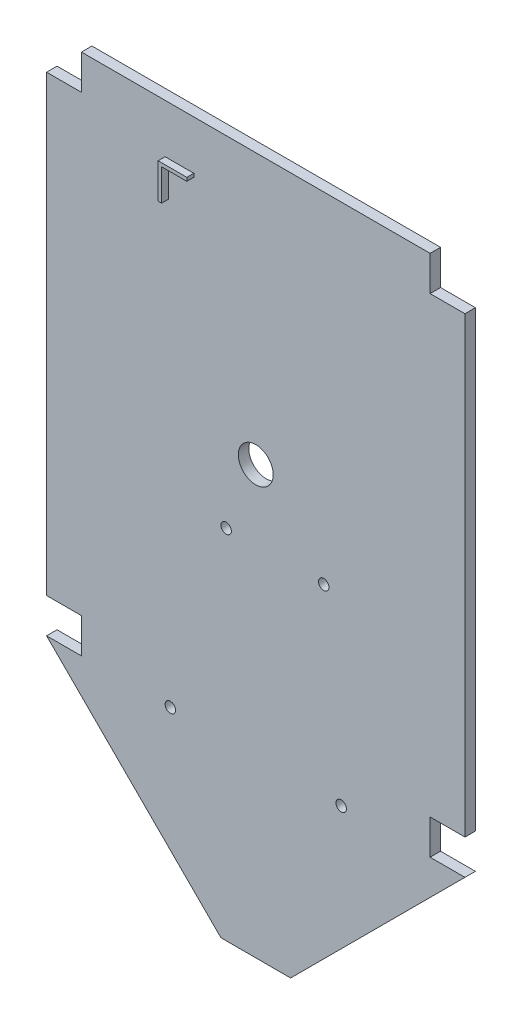
ISO-10303-21;
HEADER;
FILE_DESCRIPTION(('STEP AP214'),'2;1');
FILE_NAME('part.step','',(''),(''),'','','');
FILE_SCHEMA(('AUTOMOTIVE_DESIGN { 1 0 10303 214 1 1 1 1 }'));
ENDSEC;
DATA;
#1=APPLICATION_CONTEXT('core data for automotive mechanical design processes');
#2=APPLICATION_PROTOCOL_DEFINITION('international standard','automotive_design',2000,#1);
#3=PRODUCT_CONTEXT('',#1,'mechanical');
#4=PRODUCT('Part','Part','',(#3));
#5=PRODUCT_RELATED_PRODUCT_CATEGORY('part','',(#4));
#6=PRODUCT_DEFINITION_FORMATION('','',#4);
#7=PRODUCT_DEFINITION_CONTEXT('part definition',#1,'design');
#8=PRODUCT_DEFINITION('design','',#6,#7);
#9=PRODUCT_DEFINITION_SHAPE('','',#8);
#10=(LENGTH_UNIT() NAMED_UNIT(*) SI_UNIT(.MILLI.,.METRE.));
#11=(NAMED_UNIT(*) PLANE_ANGLE_UNIT() SI_UNIT($,.RADIAN.));
#12=(NAMED_UNIT(*) SI_UNIT($,.STERADIAN.) SOLID_ANGLE_UNIT());
#13=UNCERTAINTY_MEASURE_WITH_UNIT(LENGTH_MEASURE(1.E-05),#10,'distance_accuracy_value','');
#14=(GEOMETRIC_REPRESENTATION_CONTEXT(3) GLOBAL_UNCERTAINTY_ASSIGNED_CONTEXT((#13)) GLOBAL_UNIT_ASSIGNED_CONTEXT((#10,
#11,#12)) REPRESENTATION_CONTEXT('',''));
#15=CARTESIAN_POINT('',(0.,0.,0.));
#16=DIRECTION('',(0.,0.,1.));
#17=DIRECTION('',(1.,0.,0.));
#18=AXIS2_PLACEMENT_3D('',#15,#16,#17);
#19=CARTESIAN_POINT('',(0.,-210.,3.));
#20=DIRECTION('',(0.,0.,1.));
#21=DIRECTION('',(1.,0.,0.));
#22=AXIS2_PLACEMENT_3D('',#19,#20,#21);
#23=PLANE('',#22);
#24=CARTESIAN_POINT('',(1.59594559789866E-13,-77.5,3.));
#25=DIRECTION('',(0.,0.,1.));
#26=DIRECTION('',(1.,0.,0.));
#27=AXIS2_PLACEMENT_3D('',#24,#25,#26);
#28=CIRCLE('',#27,5.);
#29=CARTESIAN_POINT('',(5.00000000000016,-77.5,3.));
#30=VERTEX_POINT('',#29);
#31=EDGE_CURVE('E636',#30,#30,#28,.T.);
#32=ORIENTED_EDGE('',*,*,#31,.F.);
#33=EDGE_LOOP('',(#32));
#34=FACE_BOUND('',#33,.T.);
#35=DIRECTION('',(0.707106781186546,0.707106781186549,0.));
#36=VECTOR('',#35,1.);
#37=CARTESIAN_POINT('',(59.9999999999998,-150.,3.));
#38=LINE('',#37,#36);
#39=CARTESIAN_POINT('',(9.99999999999994,-200.,3.));
#40=VERTEX_POINT('',#39);
#41=CARTESIAN_POINT('',(59.9999999999998,-150.,3.));
#42=VERTEX_POINT('',#41);
#43=EDGE_CURVE('E222',#40,#42,#38,.T.);
#44=ORIENTED_EDGE('',*,*,#43,.T.);
#45=DIRECTION('',(-1.,0.,0.));
#46=VECTOR('',#45,1.);
#47=CARTESIAN_POINT('',(59.9999999999998,-150.,3.));
#48=LINE('',#47,#46);
#49=CARTESIAN_POINT('',(49.9999999999998,-150.,3.));
#50=VERTEX_POINT('',#49);
#51=EDGE_CURVE('E122',#42,#50,#48,.T.);
#52=ORIENTED_EDGE('',*,*,#51,.T.);
#53=DIRECTION('',(0.,1.,0.));
#54=VECTOR('',#53,1.);
#55=CARTESIAN_POINT('',(49.9999999999998,-150.,3.));
#56=LINE('',#55,#54);
#57=CARTESIAN_POINT('',(49.9999999999998,-140.,3.));
#58=VERTEX_POINT('',#57);
#59=EDGE_CURVE('E291',#50,#58,#56,.T.);
#60=ORIENTED_EDGE('',*,*,#59,.T.);
#61=DIRECTION('',(1.,0.,0.));
#62=VECTOR('',#61,1.);
#63=CARTESIAN_POINT('',(49.9999999999998,-140.,3.));
#64=LINE('',#63,#62);
#65=CARTESIAN_POINT('',(59.9999999999998,-140.,3.));
#66=VERTEX_POINT('',#65);
#67=EDGE_CURVE('E293',#58,#66,#64,.T.);
#68=ORIENTED_EDGE('',*,*,#67,.T.);
#69=DIRECTION('',(0.,1.,0.));
#70=VECTOR('',#69,1.);
#71=CARTESIAN_POINT('',(59.9999999999998,-10.,3.));
#72=LINE('',#71,#70);
#73=CARTESIAN_POINT('',(59.9999999999998,-10.,3.));
#74=VERTEX_POINT('',#73);
#75=EDGE_CURVE('E295',#66,#74,#72,.T.);
#76=ORIENTED_EDGE('',*,*,#75,.T.);
#77=DIRECTION('',(-1.,0.,0.));
#78=VECTOR('',#77,1.);
#79=CARTESIAN_POINT('',(49.9999999999998,-10.,3.));
#80=LINE('',#79,#78);
#81=CARTESIAN_POINT('',(49.9999999999998,-10.,3.));
#82=VERTEX_POINT('',#81);
#83=EDGE_CURVE('E297',#74,#82,#80,.T.);
#84=ORIENTED_EDGE('',*,*,#83,.T.);
#85=DIRECTION('',(0.,1.,0.));
#86=VECTOR('',#85,1.);
#87=CARTESIAN_POINT('',(49.9999999999998,0.,3.));
#88=LINE('',#87,#86);
#89=CARTESIAN_POINT('',(49.9999999999998,0.,3.));
#90=VERTEX_POINT('',#89);
#91=EDGE_CURVE('E299',#82,#90,#88,.T.);
#92=ORIENTED_EDGE('',*,*,#91,.T.);
#93=DIRECTION('',(-1.,0.,0.));
#94=VECTOR('',#93,1.);
#95=CARTESIAN_POINT('',(49.9999999999998,0.,3.));
#96=LINE('',#95,#94);
#97=CARTESIAN_POINT('',(-49.9999999999998,0.,3.));
#98=VERTEX_POINT('',#97);
#99=EDGE_CURVE('E301',#90,#98,#96,.T.);
#100=ORIENTED_EDGE('',*,*,#99,.T.);
#101=DIRECTION('',(0.,-1.,0.));
#102=VECTOR('',#101,1.);
#103=CARTESIAN_POINT('',(-49.9999999999998,0.,3.));
#104=LINE('',#103,#102);
#105=CARTESIAN_POINT('',(-49.9999999999998,-10.,3.));
#106=VERTEX_POINT('',#105);
#107=EDGE_CURVE('E303',#98,#106,#104,.T.);
#108=ORIENTED_EDGE('',*,*,#107,.T.);
#109=DIRECTION('',(-1.,0.,0.));
#110=VECTOR('',#109,1.);
#111=CARTESIAN_POINT('',(-49.9999999999998,-10.,3.));
#112=LINE('',#111,#110);
#113=CARTESIAN_POINT('',(-59.9999999999998,-10.,3.));
#114=VERTEX_POINT('',#113);
#115=EDGE_CURVE('E305',#106,#114,#112,.T.);
#116=ORIENTED_EDGE('',*,*,#115,.T.);
#117=DIRECTION('',(0.,-1.,0.));
#118=VECTOR('',#117,1.);
#119=CARTESIAN_POINT('',(-59.9999999999998,-10.,3.));
#120=LINE('',#119,#118);
#121=CARTESIAN_POINT('',(-59.9999999999998,-140.,3.));
#122=VERTEX_POINT('',#121);
#123=EDGE_CURVE('E307',#114,#122,#120,.T.);
#124=ORIENTED_EDGE('',*,*,#123,.T.);
#125=DIRECTION('',(1.,0.,0.));
#126=VECTOR('',#125,1.);
#127=CARTESIAN_POINT('',(-49.9999999999998,-140.,3.));
#128=LINE('',#127,#126);
#129=CARTESIAN_POINT('',(-49.9999999999998,-140.,3.));
#130=VERTEX_POINT('',#129);
#131=EDGE_CURVE('E309',#122,#130,#128,.T.);
#132=ORIENTED_EDGE('',*,*,#131,.T.);
#133=DIRECTION('',(0.,-1.,0.));
#134=VECTOR('',#133,1.);
#135=CARTESIAN_POINT('',(-49.9999999999998,-150.,3.));
#136=LINE('',#135,#134);
#137=CARTESIAN_POINT('',(-49.9999999999998,-150.,3.));
#138=VERTEX_POINT('',#137);
#139=EDGE_CURVE('E169',#130,#138,#136,.T.);
#140=ORIENTED_EDGE('',*,*,#139,.T.);
#141=DIRECTION('',(-1.,0.,0.));
#142=VECTOR('',#141,1.);
#143=CARTESIAN_POINT('',(-59.9999999999998,-150.,3.));
#144=LINE('',#143,#142);
#145=CARTESIAN_POINT('',(-59.9999999999998,-150.,3.));
#146=VERTEX_POINT('',#145);
#147=EDGE_CURVE('E162',#138,#146,#144,.T.);
#148=ORIENTED_EDGE('',*,*,#147,.T.);
#149=DIRECTION('',(0.707106781186546,-0.707106781186549,0.));
#150=VECTOR('',#149,1.);
#151=CARTESIAN_POINT('',(-59.9999999999998,-150.,3.));
#152=LINE('',#151,#150);
#153=CARTESIAN_POINT('',(-9.99999999999994,-200.,3.));
#154=VERTEX_POINT('',#153);
#155=EDGE_CURVE('E166',#146,#154,#152,.T.);
#156=ORIENTED_EDGE('',*,*,#155,.T.);
#157=DIRECTION('',(1.,0.,0.));
#158=VECTOR('',#157,1.);
#159=CARTESIAN_POINT('',(-9.99999999999994,-200.,3.));
#160=LINE('',#159,#158);
#161=EDGE_CURVE('E57',#154,#40,#160,.T.);
#162=ORIENTED_EDGE('',*,*,#161,.T.);
#163=EDGE_LOOP('',(#44,#52,#60,#68,#76,#84,#92,#100,#108,#116,#124,#132,#140,#148,#156,#162));
#164=FACE_BOUND('',#163,.T.);
#165=CARTESIAN_POINT('',(-24.4999999999998,-150.,3.));
#166=DIRECTION('',(0.,0.,1.));
#167=DIRECTION('',(1.,0.,0.));
#168=AXIS2_PLACEMENT_3D('',#165,#166,#167);
#169=CIRCLE('',#168,1.5);
#170=CARTESIAN_POINT('',(-22.9999999999998,-150.,3.));
#171=VERTEX_POINT('',#170);
#172=EDGE_CURVE('E260',#171,#171,#169,.T.);
#173=ORIENTED_EDGE('',*,*,#172,.F.);
#174=EDGE_LOOP('',(#173));
#175=FACE_BOUND('',#174,.T.);
#176=CARTESIAN_POINT('',(-8.49999999999984,-97.5,3.));
#177=DIRECTION('',(0.,0.,1.));
#178=DIRECTION('',(1.,0.,0.));
#179=AXIS2_PLACEMENT_3D('',#176,#177,#178);
#180=CIRCLE('',#179,1.5);
#181=CARTESIAN_POINT('',(-6.99999999999984,-97.5,3.));
#182=VERTEX_POINT('',#181);
#183=EDGE_CURVE('E264',#182,#182,#180,.T.);
#184=ORIENTED_EDGE('',*,*,#183,.F.);
#185=EDGE_LOOP('',(#184));
#186=FACE_BOUND('',#185,.T.);
#187=CARTESIAN_POINT('',(19.5000000000002,-97.5,3.));
#188=DIRECTION('',(0.,0.,1.));
#189=DIRECTION('',(1.,0.,0.));
#190=AXIS2_PLACEMENT_3D('',#187,#188,#189);
#191=CIRCLE('',#190,1.5);
#192=CARTESIAN_POINT('',(21.0000000000002,-97.5,3.));
#193=VERTEX_POINT('',#192);
#194=EDGE_CURVE('E267',#193,#193,#191,.T.);
#195=ORIENTED_EDGE('',*,*,#194,.F.);
#196=EDGE_LOOP('',(#195));
#197=FACE_BOUND('',#196,.T.);
#198=CARTESIAN_POINT('',(24.5000000000002,-150.,3.));
#199=DIRECTION('',(0.,0.,1.));
#200=DIRECTION('',(1.,0.,0.));
#201=AXIS2_PLACEMENT_3D('',#198,#199,#200);
#202=CIRCLE('',#201,1.5);
#203=CARTESIAN_POINT('',(26.0000000000002,-150.,3.));
#204=VERTEX_POINT('',#203);
#205=EDGE_CURVE('E270',#204,#204,#202,.T.);
#206=ORIENTED_EDGE('',*,*,#205,.F.);
#207=EDGE_LOOP('',(#206));
#208=FACE_BOUND('',#207,.T.);
#209=DIRECTION('',(0.,1.,0.));
#210=VECTOR('',#209,1.);
#211=CARTESIAN_POINT('',(-17.7737762237761,-15.,3.));
#212=LINE('',#211,#210);
#213=CARTESIAN_POINT('',(-17.7737762237761,-15.,3.));
#214=VERTEX_POINT('',#213);
#215=CARTESIAN_POINT('',(-17.7737762237761,-14.,3.));
#216=VERTEX_POINT('',#215);
#217=EDGE_CURVE('E641',#214,#216,#212,.T.);
#218=ORIENTED_EDGE('',*,*,#217,.F.);
#219=DIRECTION('',(1.,0.,0.));
#220=VECTOR('',#219,1.);
#221=CARTESIAN_POINT('',(-24.9999999999998,-15.,3.));
#222=LINE('',#221,#220);
#223=CARTESIAN_POINT('',(-24.9999999999998,-15.,3.));
#224=VERTEX_POINT('',#223);
#225=EDGE_CURVE('E639',#224,#214,#222,.T.);
#226=ORIENTED_EDGE('',*,*,#225,.F.);
#227=DIRECTION('',(0.,1.,0.));
#228=VECTOR('',#227,1.);
#229=CARTESIAN_POINT('',(-24.9999999999998,-15.,3.));
#230=LINE('',#229,#228);
#231=CARTESIAN_POINT('',(-24.9999999999998,-24.0374844599845,3.));
#232=VERTEX_POINT('',#231);
#233=EDGE_CURVE('E649',#232,#224,#230,.T.);
#234=ORIENTED_EDGE('',*,*,#233,.F.);
#235=DIRECTION('',(1.,0.,0.));
#236=VECTOR('',#235,1.);
#237=CARTESIAN_POINT('',(-25.9999999999998,-24.0374844599845,3.));
#238=LINE('',#237,#236);
#239=CARTESIAN_POINT('',(-25.9999999999998,-24.0374844599845,3.));
#240=VERTEX_POINT('',#239);
#241=EDGE_CURVE('E673',#240,#232,#238,.T.);
#242=ORIENTED_EDGE('',*,*,#241,.F.);
#243=DIRECTION('',(0.,-1.,0.));
#244=VECTOR('',#243,1.);
#245=CARTESIAN_POINT('',(-25.9999999999998,-14.,3.));
#246=LINE('',#245,#244);
#247=CARTESIAN_POINT('',(-25.9999999999998,-14.,3.));
#248=VERTEX_POINT('',#247);
#249=EDGE_CURVE('E670',#248,#240,#246,.T.);
#250=ORIENTED_EDGE('',*,*,#249,.F.);
#251=DIRECTION('',(-1.,0.,0.));
#252=VECTOR('',#251,1.);
#253=CARTESIAN_POINT('',(-17.7737762237761,-14.,3.));
#254=LINE('',#253,#252);
#255=EDGE_CURVE('E667',#216,#248,#254,.T.);
#256=ORIENTED_EDGE('',*,*,#255,.F.);
#257=EDGE_LOOP('',(#218,#226,#234,#242,#250,#256));
#258=FACE_BOUND('',#257,.T.);
#259=ADVANCED_FACE('F31',(#34,#164,#175,#186,#197,#208,#258),#23,.T.);
#260=CARTESIAN_POINT('',(59.9999999999998,-150.,3.));
#261=DIRECTION('',(-0.707106781186549,0.707106781186546,0.));
#262=DIRECTION('',(-0.707106781186546,-0.707106781186549,0.));
#263=AXIS2_PLACEMENT_3D('',#260,#261,#262);
#264=PLANE('',#263);
#265=DIRECTION('',(0.707106781186546,0.707106781186549,0.));
#266=VECTOR('',#265,1.);
#267=CARTESIAN_POINT('',(59.9999999999998,-150.,0.));
#268=LINE('',#267,#266);
#269=CARTESIAN_POINT('',(9.99999999999994,-200.,0.));
#270=VERTEX_POINT('',#269);
#271=CARTESIAN_POINT('',(59.9999999999998,-150.,0.));
#272=VERTEX_POINT('',#271);
#273=EDGE_CURVE('E190',#270,#272,#268,.T.);
#274=ORIENTED_EDGE('',*,*,#273,.T.);
#275=DIRECTION('',(0.,0.,-1.));
#276=VECTOR('',#275,1.);
#277=CARTESIAN_POINT('',(59.9999999999998,-150.,3.));
#278=LINE('',#277,#276);
#279=EDGE_CURVE('E11',#42,#272,#278,.T.);
#280=ORIENTED_EDGE('',*,*,#279,.F.);
#281=ORIENTED_EDGE('',*,*,#43,.F.);
#282=DIRECTION('',(0.,0.,-1.));
#283=VECTOR('',#282,1.);
#284=CARTESIAN_POINT('',(9.99999999999994,-200.,3.));
#285=LINE('',#284,#283);
#286=EDGE_CURVE('E186',#40,#270,#285,.T.);
#287=ORIENTED_EDGE('',*,*,#286,.T.);
#288=EDGE_LOOP('',(#274,#280,#281,#287));
#289=FACE_BOUND('',#288,.T.);
#290=ADVANCED_FACE('F33',(#289),#264,.F.);
#291=CARTESIAN_POINT('',(59.9999999999998,-150.,3.));
#292=DIRECTION('',(0.,-1.,0.));
#293=DIRECTION('',(0.,0.,-1.));
#294=AXIS2_PLACEMENT_3D('',#291,#292,#293);
#295=PLANE('',#294);
#296=DIRECTION('',(-1.,0.,0.));
#297=VECTOR('',#296,1.);
#298=CARTESIAN_POINT('',(59.9999999999998,-150.,0.));
#299=LINE('',#298,#297);
#300=CARTESIAN_POINT('',(49.9999999999998,-150.,0.));
#301=VERTEX_POINT('',#300);
#302=EDGE_CURVE('E193',#272,#301,#299,.T.);
#303=ORIENTED_EDGE('',*,*,#302,.T.);
#304=DIRECTION('',(0.,0.,-1.));
#305=VECTOR('',#304,1.);
#306=CARTESIAN_POINT('',(49.9999999999998,-150.,3.));
#307=LINE('',#306,#305);
#308=EDGE_CURVE('E40',#50,#301,#307,.T.);
#309=ORIENTED_EDGE('',*,*,#308,.F.);
#310=ORIENTED_EDGE('',*,*,#51,.F.);
#311=ORIENTED_EDGE('',*,*,#279,.T.);
#312=EDGE_LOOP('',(#303,#309,#310,#311));
#313=FACE_BOUND('',#312,.T.);
#314=ADVANCED_FACE('F329',(#313),#295,.F.);
#315=CARTESIAN_POINT('',(49.9999999999998,-150.,3.));
#316=DIRECTION('',(-1.,0.,0.));
#317=DIRECTION('',(0.,0.,1.));
#318=AXIS2_PLACEMENT_3D('',#315,#316,#317);
#319=PLANE('',#318);
#320=DIRECTION('',(0.,1.,0.));
#321=VECTOR('',#320,1.);
#322=CARTESIAN_POINT('',(49.9999999999998,-150.,0.));
#323=LINE('',#322,#321);
#324=CARTESIAN_POINT('',(49.9999999999998,-140.,0.));
#325=VERTEX_POINT('',#324);
#326=EDGE_CURVE('E196',#301,#325,#323,.T.);
#327=ORIENTED_EDGE('',*,*,#326,.T.);
#328=DIRECTION('',(0.,0.,-1.));
#329=VECTOR('',#328,1.);
#330=CARTESIAN_POINT('',(49.9999999999998,-140.,3.));
#331=LINE('',#330,#329);
#332=EDGE_CURVE('E253',#58,#325,#331,.T.);
#333=ORIENTED_EDGE('',*,*,#332,.F.);
#334=ORIENTED_EDGE('',*,*,#59,.F.);
#335=ORIENTED_EDGE('',*,*,#308,.T.);
#336=EDGE_LOOP('',(#327,#333,#334,#335));
#337=FACE_BOUND('',#336,.T.);
#338=ADVANCED_FACE('F332',(#337),#319,.F.);
#339=CARTESIAN_POINT('',(49.9999999999998,-140.,3.));
#340=DIRECTION('',(0.,1.,0.));
#341=DIRECTION('',(0.,0.,1.));
#342=AXIS2_PLACEMENT_3D('',#339,#340,#341);
#343=PLANE('',#342);
#344=DIRECTION('',(1.,0.,0.));
#345=VECTOR('',#344,1.);
#346=CARTESIAN_POINT('',(49.9999999999998,-140.,0.));
#347=LINE('',#346,#345);
#348=CARTESIAN_POINT('',(59.9999999999998,-140.,0.));
#349=VERTEX_POINT('',#348);
#350=EDGE_CURVE('E198',#325,#349,#347,.T.);
#351=ORIENTED_EDGE('',*,*,#350,.T.);
#352=DIRECTION('',(0.,0.,-1.));
#353=VECTOR('',#352,1.);
#354=CARTESIAN_POINT('',(59.9999999999998,-140.,3.));
#355=LINE('',#354,#353);
#356=EDGE_CURVE('E250',#66,#349,#355,.T.);
#357=ORIENTED_EDGE('',*,*,#356,.F.);
#358=ORIENTED_EDGE('',*,*,#67,.F.);
#359=ORIENTED_EDGE('',*,*,#332,.T.);
#360=EDGE_LOOP('',(#351,#357,#358,#359));
#361=FACE_BOUND('',#360,.T.);
#362=ADVANCED_FACE('F337',(#361),#343,.F.);
#363=CARTESIAN_POINT('',(59.9999999999998,-10.,3.));
#364=DIRECTION('',(-1.,0.,0.));
#365=DIRECTION('',(0.,-1.,0.));
#366=AXIS2_PLACEMENT_3D('',#363,#364,#365);
#367=PLANE('',#366);
#368=DIRECTION('',(0.,1.,0.));
#369=VECTOR('',#368,1.);
#370=CARTESIAN_POINT('',(59.9999999999998,-10.,0.));
#371=LINE('',#370,#369);
#372=CARTESIAN_POINT('',(59.9999999999998,-10.,0.));
#373=VERTEX_POINT('',#372);
#374=EDGE_CURVE('E200',#349,#373,#371,.T.);
#375=ORIENTED_EDGE('',*,*,#374,.T.);
#376=DIRECTION('',(0.,0.,-1.));
#377=VECTOR('',#376,1.);
#378=CARTESIAN_POINT('',(59.9999999999998,-10.,3.));
#379=LINE('',#378,#377);
#380=EDGE_CURVE('E247',#74,#373,#379,.T.);
#381=ORIENTED_EDGE('',*,*,#380,.F.);
#382=ORIENTED_EDGE('',*,*,#75,.F.);
#383=ORIENTED_EDGE('',*,*,#356,.T.);
#384=EDGE_LOOP('',(#375,#381,#382,#383));
#385=FACE_BOUND('',#384,.T.);
#386=ADVANCED_FACE('F343',(#385),#367,.F.);
#387=CARTESIAN_POINT('',(49.9999999999998,-10.,3.));
#388=DIRECTION('',(0.,-1.,0.));
#389=DIRECTION('',(1.,0.,0.));
#390=AXIS2_PLACEMENT_3D('',#387,#388,#389);
#391=PLANE('',#390);
#392=DIRECTION('',(-1.,0.,0.));
#393=VECTOR('',#392,1.);
#394=CARTESIAN_POINT('',(49.9999999999998,-10.,0.));
#395=LINE('',#394,#393);
#396=CARTESIAN_POINT('',(49.9999999999998,-10.,0.));
#397=VERTEX_POINT('',#396);
#398=EDGE_CURVE('E202',#373,#397,#395,.T.);
#399=ORIENTED_EDGE('',*,*,#398,.T.);
#400=DIRECTION('',(0.,0.,-1.));
#401=VECTOR('',#400,1.);
#402=CARTESIAN_POINT('',(49.9999999999998,-10.,3.));
#403=LINE('',#402,#401);
#404=EDGE_CURVE('E244',#82,#397,#403,.T.);
#405=ORIENTED_EDGE('',*,*,#404,.F.);
#406=ORIENTED_EDGE('',*,*,#83,.F.);
#407=ORIENTED_EDGE('',*,*,#380,.T.);
#408=EDGE_LOOP('',(#399,#405,#406,#407));
#409=FACE_BOUND('',#408,.T.);
#410=ADVANCED_FACE('F347',(#409),#391,.F.);
#411=CARTESIAN_POINT('',(49.9999999999998,0.,3.));
#412=DIRECTION('',(-1.,0.,0.));
#413=DIRECTION('',(0.,0.,1.));
#414=AXIS2_PLACEMENT_3D('',#411,#412,#413);
#415=PLANE('',#414);
#416=DIRECTION('',(0.,1.,0.));
#417=VECTOR('',#416,1.);
#418=CARTESIAN_POINT('',(49.9999999999998,0.,0.));
#419=LINE('',#418,#417);
#420=CARTESIAN_POINT('',(49.9999999999998,0.,0.));
#421=VERTEX_POINT('',#420);
#422=EDGE_CURVE('E204',#397,#421,#419,.T.);
#423=ORIENTED_EDGE('',*,*,#422,.T.);
#424=DIRECTION('',(0.,0.,-1.));
#425=VECTOR('',#424,1.);
#426=CARTESIAN_POINT('',(49.9999999999998,0.,3.));
#427=LINE('',#426,#425);
#428=EDGE_CURVE('E241',#90,#421,#427,.T.);
#429=ORIENTED_EDGE('',*,*,#428,.F.);
#430=ORIENTED_EDGE('',*,*,#91,.F.);
#431=ORIENTED_EDGE('',*,*,#404,.T.);
#432=EDGE_LOOP('',(#423,#429,#430,#431));
#433=FACE_BOUND('',#432,.T.);
#434=ADVANCED_FACE('F352',(#433),#415,.F.);
#435=CARTESIAN_POINT('',(49.9999999999998,0.,3.));
#436=DIRECTION('',(0.,-1.,0.));
#437=DIRECTION('',(0.,0.,-1.));
#438=AXIS2_PLACEMENT_3D('',#435,#436,#437);
#439=PLANE('',#438);
#440=DIRECTION('',(-1.,0.,0.));
#441=VECTOR('',#440,1.);
#442=CARTESIAN_POINT('',(49.9999999999998,0.,0.));
#443=LINE('',#442,#441);
#444=CARTESIAN_POINT('',(-49.9999999999998,0.,0.));
#445=VERTEX_POINT('',#444);
#446=EDGE_CURVE('E206',#421,#445,#443,.T.);
#447=ORIENTED_EDGE('',*,*,#446,.T.);
#448=DIRECTION('',(0.,0.,-1.));
#449=VECTOR('',#448,1.);
#450=CARTESIAN_POINT('',(-49.9999999999998,0.,3.));
#451=LINE('',#450,#449);
#452=EDGE_CURVE('E238',#98,#445,#451,.T.);
#453=ORIENTED_EDGE('',*,*,#452,.F.);
#454=ORIENTED_EDGE('',*,*,#99,.F.);
#455=ORIENTED_EDGE('',*,*,#428,.T.);
#456=EDGE_LOOP('',(#447,#453,#454,#455));
#457=FACE_BOUND('',#456,.T.);
#458=ADVANCED_FACE('F358',(#457),#439,.F.);
#459=CARTESIAN_POINT('',(-49.9999999999998,0.,3.));
#460=DIRECTION('',(1.,0.,0.));
#461=DIRECTION('',(0.,0.,-1.));
#462=AXIS2_PLACEMENT_3D('',#459,#460,#461);
#463=PLANE('',#462);
#464=DIRECTION('',(0.,-1.,0.));
#465=VECTOR('',#464,1.);
#466=CARTESIAN_POINT('',(-49.9999999999998,0.,0.));
#467=LINE('',#466,#465);
#468=CARTESIAN_POINT('',(-49.9999999999998,-10.,0.));
#469=VERTEX_POINT('',#468);
#470=EDGE_CURVE('E208',#445,#469,#467,.T.);
#471=ORIENTED_EDGE('',*,*,#470,.T.);
#472=DIRECTION('',(0.,0.,-1.));
#473=VECTOR('',#472,1.);
#474=CARTESIAN_POINT('',(-49.9999999999998,-10.,3.));
#475=LINE('',#474,#473);
#476=EDGE_CURVE('E235',#106,#469,#475,.T.);
#477=ORIENTED_EDGE('',*,*,#476,.F.);
#478=ORIENTED_EDGE('',*,*,#107,.F.);
#479=ORIENTED_EDGE('',*,*,#452,.T.);
#480=EDGE_LOOP('',(#471,#477,#478,#479));
#481=FACE_BOUND('',#480,.T.);
#482=ADVANCED_FACE('F362',(#481),#463,.F.);
#483=CARTESIAN_POINT('',(-49.9999999999998,-10.,3.));
#484=DIRECTION('',(0.,-1.,0.));
#485=DIRECTION('',(1.,0.,0.));
#486=AXIS2_PLACEMENT_3D('',#483,#484,#485);
#487=PLANE('',#486);
#488=DIRECTION('',(-1.,0.,0.));
#489=VECTOR('',#488,1.);
#490=CARTESIAN_POINT('',(-49.9999999999998,-10.,0.));
#491=LINE('',#490,#489);
#492=CARTESIAN_POINT('',(-59.9999999999998,-10.,0.));
#493=VERTEX_POINT('',#492);
#494=EDGE_CURVE('E210',#469,#493,#491,.T.);
#495=ORIENTED_EDGE('',*,*,#494,.T.);
#496=DIRECTION('',(0.,0.,-1.));
#497=VECTOR('',#496,1.);
#498=CARTESIAN_POINT('',(-59.9999999999998,-10.,3.));
#499=LINE('',#498,#497);
#500=EDGE_CURVE('E232',#114,#493,#499,.T.);
#501=ORIENTED_EDGE('',*,*,#500,.F.);
#502=ORIENTED_EDGE('',*,*,#115,.F.);
#503=ORIENTED_EDGE('',*,*,#476,.T.);
#504=EDGE_LOOP('',(#495,#501,#502,#503));
#505=FACE_BOUND('',#504,.T.);
#506=ADVANCED_FACE('F367',(#505),#487,.F.);
#507=CARTESIAN_POINT('',(-59.9999999999998,-10.,3.));
#508=DIRECTION('',(1.,0.,0.));
#509=DIRECTION('',(0.,1.,0.));
#510=AXIS2_PLACEMENT_3D('',#507,#508,#509);
#511=PLANE('',#510);
#512=DIRECTION('',(0.,-1.,0.));
#513=VECTOR('',#512,1.);
#514=CARTESIAN_POINT('',(-59.9999999999998,-10.,0.));
#515=LINE('',#514,#513);
#516=CARTESIAN_POINT('',(-59.9999999999998,-140.,0.));
#517=VERTEX_POINT('',#516);
#518=EDGE_CURVE('E212',#493,#517,#515,.T.);
#519=ORIENTED_EDGE('',*,*,#518,.T.);
#520=DIRECTION('',(0.,0.,-1.));
#521=VECTOR('',#520,1.);
#522=CARTESIAN_POINT('',(-59.9999999999998,-140.,3.));
#523=LINE('',#522,#521);
#524=EDGE_CURVE('E229',#122,#517,#523,.T.);
#525=ORIENTED_EDGE('',*,*,#524,.F.);
#526=ORIENTED_EDGE('',*,*,#123,.F.);
#527=ORIENTED_EDGE('',*,*,#500,.T.);
#528=EDGE_LOOP('',(#519,#525,#526,#527));
#529=FACE_BOUND('',#528,.T.);
#530=ADVANCED_FACE('F370',(#529),#511,.F.);
#531=CARTESIAN_POINT('',(-49.9999999999998,-140.,3.));
#532=DIRECTION('',(0.,1.,0.));
#533=DIRECTION('',(0.,0.,1.));
#534=AXIS2_PLACEMENT_3D('',#531,#532,#533);
#535=PLANE('',#534);
#536=DIRECTION('',(1.,0.,0.));
#537=VECTOR('',#536,1.);
#538=CARTESIAN_POINT('',(-49.9999999999998,-140.,0.));
#539=LINE('',#538,#537);
#540=CARTESIAN_POINT('',(-49.9999999999998,-140.,0.));
#541=VERTEX_POINT('',#540);
#542=EDGE_CURVE('E214',#517,#541,#539,.T.);
#543=ORIENTED_EDGE('',*,*,#542,.T.);
#544=DIRECTION('',(0.,0.,-1.));
#545=VECTOR('',#544,1.);
#546=CARTESIAN_POINT('',(-49.9999999999998,-140.,3.));
#547=LINE('',#546,#545);
#548=EDGE_CURVE('E226',#130,#541,#547,.T.);
#549=ORIENTED_EDGE('',*,*,#548,.F.);
#550=ORIENTED_EDGE('',*,*,#131,.F.);
#551=ORIENTED_EDGE('',*,*,#524,.T.);
#552=EDGE_LOOP('',(#543,#549,#550,#551));
#553=FACE_BOUND('',#552,.T.);
#554=ADVANCED_FACE('F315',(#553),#535,.F.);
#555=CARTESIAN_POINT('',(-49.9999999999998,-150.,3.));
#556=DIRECTION('',(1.,0.,0.));
#557=DIRECTION('',(0.,0.,-1.));
#558=AXIS2_PLACEMENT_3D('',#555,#556,#557);
#559=PLANE('',#558);
#560=DIRECTION('',(0.,-1.,0.));
#561=VECTOR('',#560,1.);
#562=CARTESIAN_POINT('',(-49.9999999999998,-150.,0.));
#563=LINE('',#562,#561);
#564=CARTESIAN_POINT('',(-49.9999999999998,-150.,0.));
#565=VERTEX_POINT('',#564);
#566=EDGE_CURVE('E216',#541,#565,#563,.T.);
#567=ORIENTED_EDGE('',*,*,#566,.T.);
#568=DIRECTION('',(0.,0.,-1.));
#569=VECTOR('',#568,1.);
#570=CARTESIAN_POINT('',(-49.9999999999998,-150.,3.));
#571=LINE('',#570,#569);
#572=EDGE_CURVE('E181',#138,#565,#571,.T.);
#573=ORIENTED_EDGE('',*,*,#572,.F.);
#574=ORIENTED_EDGE('',*,*,#139,.F.);
#575=ORIENTED_EDGE('',*,*,#548,.T.);
#576=EDGE_LOOP('',(#567,#573,#574,#575));
#577=FACE_BOUND('',#576,.T.);
#578=ADVANCED_FACE('F319',(#577),#559,.F.);
#579=CARTESIAN_POINT('',(-59.9999999999998,-150.,3.));
#580=DIRECTION('',(0.,-1.,0.));
#581=DIRECTION('',(0.,0.,-1.));
#582=AXIS2_PLACEMENT_3D('',#579,#580,#581);
#583=PLANE('',#582);
#584=DIRECTION('',(-1.,0.,0.));
#585=VECTOR('',#584,1.);
#586=CARTESIAN_POINT('',(-59.9999999999998,-150.,0.));
#587=LINE('',#586,#585);
#588=CARTESIAN_POINT('',(-59.9999999999998,-150.,0.));
#589=VERTEX_POINT('',#588);
#590=EDGE_CURVE('E178',#565,#589,#587,.T.);
#591=ORIENTED_EDGE('',*,*,#590,.T.);
#592=DIRECTION('',(0.,0.,-1.));
#593=VECTOR('',#592,1.);
#594=CARTESIAN_POINT('',(-59.9999999999998,-150.,3.));
#595=LINE('',#594,#593);
#596=EDGE_CURVE('E175',#146,#589,#595,.T.);
#597=ORIENTED_EDGE('',*,*,#596,.F.);
#598=ORIENTED_EDGE('',*,*,#147,.F.);
#599=ORIENTED_EDGE('',*,*,#572,.T.);
#600=EDGE_LOOP('',(#591,#597,#598,#599));
#601=FACE_BOUND('',#600,.T.);
#602=ADVANCED_FACE('F176',(#601),#583,.F.);
#603=CARTESIAN_POINT('',(-59.9999999999998,-150.,3.));
#604=DIRECTION('',(0.707106781186549,0.707106781186546,0.));
#605=DIRECTION('',(-0.707106781186546,0.707106781186549,0.));
#606=AXIS2_PLACEMENT_3D('',#603,#604,#605);
#607=PLANE('',#606);
#608=DIRECTION('',(0.707106781186546,-0.707106781186549,0.));
#609=VECTOR('',#608,1.);
#610=CARTESIAN_POINT('',(-59.9999999999998,-150.,0.));
#611=LINE('',#610,#609);
#612=CARTESIAN_POINT('',(-9.99999999999994,-200.,0.));
#613=VERTEX_POINT('',#612);
#614=EDGE_CURVE('E219',#589,#613,#611,.T.);
#615=ORIENTED_EDGE('',*,*,#614,.T.);
#616=DIRECTION('',(0.,0.,-1.));
#617=VECTOR('',#616,1.);
#618=CARTESIAN_POINT('',(-9.99999999999994,-200.,3.));
#619=LINE('',#618,#617);
#620=EDGE_CURVE('E182',#154,#613,#619,.T.);
#621=ORIENTED_EDGE('',*,*,#620,.F.);
#622=ORIENTED_EDGE('',*,*,#155,.F.);
#623=ORIENTED_EDGE('',*,*,#596,.T.);
#624=EDGE_LOOP('',(#615,#621,#622,#623));
#625=FACE_BOUND('',#624,.T.);
#626=ADVANCED_FACE('F184',(#625),#607,.F.);
#627=CARTESIAN_POINT('',(-9.99999999999994,-200.,3.));
#628=DIRECTION('',(0.,1.,0.));
#629=DIRECTION('',(0.,0.,1.));
#630=AXIS2_PLACEMENT_3D('',#627,#628,#629);
#631=PLANE('',#630);
#632=DIRECTION('',(1.,0.,0.));
#633=VECTOR('',#632,1.);
#634=CARTESIAN_POINT('',(-9.99999999999994,-200.,0.));
#635=LINE('',#634,#633);
#636=EDGE_CURVE('E114',#613,#270,#635,.T.);
#637=ORIENTED_EDGE('',*,*,#636,.T.);
#638=ORIENTED_EDGE('',*,*,#286,.F.);
#639=ORIENTED_EDGE('',*,*,#161,.F.);
#640=ORIENTED_EDGE('',*,*,#620,.T.);
#641=EDGE_LOOP('',(#637,#638,#639,#640));
#642=FACE_BOUND('',#641,.T.);
#643=ADVANCED_FACE('F323',(#642),#631,.F.);
#644=CARTESIAN_POINT('',(0.,-210.,0.));
#645=DIRECTION('',(0.,0.,1.));
#646=DIRECTION('',(1.,0.,0.));
#647=AXIS2_PLACEMENT_3D('',#644,#645,#646);
#648=PLANE('',#647);
#649=CARTESIAN_POINT('',(1.59594559789866E-13,-77.5,0.));
#650=DIRECTION('',(0.,0.,1.));
#651=DIRECTION('',(1.,0.,0.));
#652=AXIS2_PLACEMENT_3D('',#649,#650,#651);
#653=CIRCLE('',#652,5.);
#654=CARTESIAN_POINT('',(5.00000000000016,-77.5,0.));
#655=VERTEX_POINT('',#654);
#656=EDGE_CURVE('E35',#655,#655,#653,.T.);
#657=ORIENTED_EDGE('',*,*,#656,.T.);
#658=EDGE_LOOP('',(#657));
#659=FACE_BOUND('',#658,.T.);
#660=CARTESIAN_POINT('',(24.5000000000002,-150.,0.));
#661=DIRECTION('',(0.,0.,1.));
#662=DIRECTION('',(1.,0.,0.));
#663=AXIS2_PLACEMENT_3D('',#660,#661,#662);
#664=CIRCLE('',#663,1.5);
#665=CARTESIAN_POINT('',(26.0000000000002,-150.,0.));
#666=VERTEX_POINT('',#665);
#667=EDGE_CURVE('E268',#666,#666,#664,.T.);
#668=ORIENTED_EDGE('',*,*,#667,.T.);
#669=EDGE_LOOP('',(#668));
#670=FACE_BOUND('',#669,.T.);
#671=CARTESIAN_POINT('',(19.5000000000002,-97.5,0.));
#672=DIRECTION('',(0.,0.,1.));
#673=DIRECTION('',(1.,0.,0.));
#674=AXIS2_PLACEMENT_3D('',#671,#672,#673);
#675=CIRCLE('',#674,1.5);
#676=CARTESIAN_POINT('',(21.0000000000002,-97.5,0.));
#677=VERTEX_POINT('',#676);
#678=EDGE_CURVE('E265',#677,#677,#675,.T.);
#679=ORIENTED_EDGE('',*,*,#678,.T.);
#680=EDGE_LOOP('',(#679));
#681=FACE_BOUND('',#680,.T.);
#682=CARTESIAN_POINT('',(-8.49999999999984,-97.5,0.));
#683=DIRECTION('',(0.,0.,1.));
#684=DIRECTION('',(1.,0.,0.));
#685=AXIS2_PLACEMENT_3D('',#682,#683,#684);
#686=CIRCLE('',#685,1.5);
#687=CARTESIAN_POINT('',(-6.99999999999984,-97.5,0.));
#688=VERTEX_POINT('',#687);
#689=EDGE_CURVE('E261',#688,#688,#686,.T.);
#690=ORIENTED_EDGE('',*,*,#689,.T.);
#691=EDGE_LOOP('',(#690));
#692=FACE_BOUND('',#691,.T.);
#693=CARTESIAN_POINT('',(-24.4999999999998,-150.,0.));
#694=DIRECTION('',(0.,0.,1.));
#695=DIRECTION('',(1.,0.,0.));
#696=AXIS2_PLACEMENT_3D('',#693,#694,#695);
#697=CIRCLE('',#696,1.5);
#698=CARTESIAN_POINT('',(-22.9999999999998,-150.,0.));
#699=VERTEX_POINT('',#698);
#700=EDGE_CURVE('E194',#699,#699,#697,.T.);
#701=ORIENTED_EDGE('',*,*,#700,.T.);
#702=EDGE_LOOP('',(#701));
#703=FACE_BOUND('',#702,.T.);
#704=ORIENTED_EDGE('',*,*,#273,.F.);
#705=ORIENTED_EDGE('',*,*,#636,.F.);
#706=ORIENTED_EDGE('',*,*,#614,.F.);
#707=ORIENTED_EDGE('',*,*,#590,.F.);
#708=ORIENTED_EDGE('',*,*,#566,.F.);
#709=ORIENTED_EDGE('',*,*,#542,.F.);
#710=ORIENTED_EDGE('',*,*,#518,.F.);
#711=ORIENTED_EDGE('',*,*,#494,.F.);
#712=ORIENTED_EDGE('',*,*,#470,.F.);
#713=ORIENTED_EDGE('',*,*,#446,.F.);
#714=ORIENTED_EDGE('',*,*,#422,.F.);
#715=ORIENTED_EDGE('',*,*,#398,.F.);
#716=ORIENTED_EDGE('',*,*,#374,.F.);
#717=ORIENTED_EDGE('',*,*,#350,.F.);
#718=ORIENTED_EDGE('',*,*,#326,.F.);
#719=ORIENTED_EDGE('',*,*,#302,.F.);
#720=EDGE_LOOP('',(#704,#705,#706,#707,#708,#709,#710,#711,#712,#713,#714,#715,#716,#717,#718,#719));
#721=FACE_BOUND('',#720,.T.);
#722=ADVANCED_FACE('F322',(#659,#670,#681,#692,#703,#721),#648,.F.);
#723=CARTESIAN_POINT('',(-24.4999999999998,-150.,-7.));
#724=DIRECTION('',(0.,0.,1.));
#725=DIRECTION('',(1.,0.,0.));
#726=AXIS2_PLACEMENT_3D('',#723,#724,#725);
#727=CYLINDRICAL_SURFACE('',#726,1.5);
#728=ORIENTED_EDGE('',*,*,#172,.T.);
#729=EDGE_LOOP('',(#728));
#730=FACE_BOUND('',#729,.T.);
#731=ORIENTED_EDGE('',*,*,#700,.F.);
#732=EDGE_LOOP('',(#731));
#733=FACE_BOUND('',#732,.T.);
#734=ADVANCED_FACE('F388',(#730,#733),#727,.F.);
#735=CARTESIAN_POINT('',(-8.49999999999984,-97.5,-7.));
#736=DIRECTION('',(0.,0.,1.));
#737=DIRECTION('',(1.,0.,0.));
#738=AXIS2_PLACEMENT_3D('',#735,#736,#737);
#739=CYLINDRICAL_SURFACE('',#738,1.5);
#740=ORIENTED_EDGE('',*,*,#183,.T.);
#741=EDGE_LOOP('',(#740));
#742=FACE_BOUND('',#741,.T.);
#743=ORIENTED_EDGE('',*,*,#689,.F.);
#744=EDGE_LOOP('',(#743));
#745=FACE_BOUND('',#744,.T.);
#746=ADVANCED_FACE('F427',(#742,#745),#739,.F.);
#747=CARTESIAN_POINT('',(19.5000000000002,-97.5,-7.));
#748=DIRECTION('',(0.,0.,1.));
#749=DIRECTION('',(1.,0.,0.));
#750=AXIS2_PLACEMENT_3D('',#747,#748,#749);
#751=CYLINDRICAL_SURFACE('',#750,1.5);
#752=ORIENTED_EDGE('',*,*,#194,.T.);
#753=EDGE_LOOP('',(#752));
#754=FACE_BOUND('',#753,.T.);
#755=ORIENTED_EDGE('',*,*,#678,.F.);
#756=EDGE_LOOP('',(#755));
#757=FACE_BOUND('',#756,.T.);
#758=ADVANCED_FACE('F434',(#754,#757),#751,.F.);
#759=CARTESIAN_POINT('',(24.5000000000002,-150.,-7.));
#760=DIRECTION('',(0.,0.,1.));
#761=DIRECTION('',(1.,0.,0.));
#762=AXIS2_PLACEMENT_3D('',#759,#760,#761);
#763=CYLINDRICAL_SURFACE('',#762,1.5);
#764=ORIENTED_EDGE('',*,*,#205,.T.);
#765=EDGE_LOOP('',(#764));
#766=FACE_BOUND('',#765,.T.);
#767=ORIENTED_EDGE('',*,*,#667,.F.);
#768=EDGE_LOOP('',(#767));
#769=FACE_BOUND('',#768,.T.);
#770=ADVANCED_FACE('F441',(#766,#769),#763,.F.);
#771=CARTESIAN_POINT('',(-24.9999999999998,-15.,5.));
#772=DIRECTION('',(0.,1.,0.));
#773=DIRECTION('',(0.,0.,1.));
#774=AXIS2_PLACEMENT_3D('',#771,#772,#773);
#775=PLANE('',#774);
#776=ORIENTED_EDGE('',*,*,#225,.T.);
#777=DIRECTION('',(0.,0.,-1.));
#778=VECTOR('',#777,1.);
#779=CARTESIAN_POINT('',(-17.7737762237761,-15.,5.));
#780=LINE('',#779,#778);
#781=CARTESIAN_POINT('',(-17.7737762237761,-15.,5.));
#782=VERTEX_POINT('',#781);
#783=EDGE_CURVE('E276',#782,#214,#780,.T.);
#784=ORIENTED_EDGE('',*,*,#783,.F.);
#785=DIRECTION('',(1.,0.,0.));
#786=VECTOR('',#785,1.);
#787=CARTESIAN_POINT('',(-24.9999999999998,-15.,5.));
#788=LINE('',#787,#786);
#789=CARTESIAN_POINT('',(-24.9999999999998,-15.,5.));
#790=VERTEX_POINT('',#789);
#791=EDGE_CURVE('E645',#790,#782,#788,.T.);
#792=ORIENTED_EDGE('',*,*,#791,.F.);
#793=DIRECTION('',(0.,0.,-1.));
#794=VECTOR('',#793,1.);
#795=CARTESIAN_POINT('',(-24.9999999999998,-15.,5.));
#796=LINE('',#795,#794);
#797=EDGE_CURVE('E663',#790,#224,#796,.T.);
#798=ORIENTED_EDGE('',*,*,#797,.T.);
#799=EDGE_LOOP('',(#776,#784,#792,#798));
#800=FACE_BOUND('',#799,.T.);
#801=ADVANCED_FACE('F449',(#800),#775,.F.);
#802=CARTESIAN_POINT('',(-17.7737762237761,-15.,5.));
#803=DIRECTION('',(-1.,0.,0.));
#804=DIRECTION('',(0.,0.,1.));
#805=AXIS2_PLACEMENT_3D('',#802,#803,#804);
#806=PLANE('',#805);
#807=ORIENTED_EDGE('',*,*,#217,.T.);
#808=DIRECTION('',(0.,0.,-1.));
#809=VECTOR('',#808,1.);
#810=CARTESIAN_POINT('',(-17.7737762237761,-14.,5.));
#811=LINE('',#810,#809);
#812=CARTESIAN_POINT('',(-17.7737762237761,-14.,5.));
#813=VERTEX_POINT('',#812);
#814=EDGE_CURVE('E281',#813,#216,#811,.T.);
#815=ORIENTED_EDGE('',*,*,#814,.F.);
#816=DIRECTION('',(0.,1.,0.));
#817=VECTOR('',#816,1.);
#818=CARTESIAN_POINT('',(-17.7737762237761,-15.,5.));
#819=LINE('',#818,#817);
#820=EDGE_CURVE('E648',#782,#813,#819,.T.);
#821=ORIENTED_EDGE('',*,*,#820,.F.);
#822=ORIENTED_EDGE('',*,*,#783,.T.);
#823=EDGE_LOOP('',(#807,#815,#821,#822));
#824=FACE_BOUND('',#823,.T.);
#825=ADVANCED_FACE('F456',(#824),#806,.F.);
#826=CARTESIAN_POINT('',(-17.7737762237761,-14.,5.));
#827=DIRECTION('',(0.,-1.,0.));
#828=DIRECTION('',(1.,0.,0.));
#829=AXIS2_PLACEMENT_3D('',#826,#827,#828);
#830=PLANE('',#829);
#831=ORIENTED_EDGE('',*,*,#255,.T.);
#832=DIRECTION('',(0.,0.,-1.));
#833=VECTOR('',#832,1.);
#834=CARTESIAN_POINT('',(-25.9999999999998,-14.,5.));
#835=LINE('',#834,#833);
#836=CARTESIAN_POINT('',(-25.9999999999998,-14.,5.));
#837=VERTEX_POINT('',#836);
#838=EDGE_CURVE('E682',#837,#248,#835,.T.);
#839=ORIENTED_EDGE('',*,*,#838,.F.);
#840=DIRECTION('',(-1.,0.,0.));
#841=VECTOR('',#840,1.);
#842=CARTESIAN_POINT('',(-17.7737762237761,-14.,5.));
#843=LINE('',#842,#841);
#844=EDGE_CURVE('E652',#813,#837,#843,.T.);
#845=ORIENTED_EDGE('',*,*,#844,.F.);
#846=ORIENTED_EDGE('',*,*,#814,.T.);
#847=EDGE_LOOP('',(#831,#839,#845,#846));
#848=FACE_BOUND('',#847,.T.);
#849=ADVANCED_FACE('F464',(#848),#830,.F.);
#850=CARTESIAN_POINT('',(-25.9999999999998,-14.,5.));
#851=DIRECTION('',(1.,0.,0.));
#852=DIRECTION('',(0.,1.,0.));
#853=AXIS2_PLACEMENT_3D('',#850,#851,#852);
#854=PLANE('',#853);
#855=ORIENTED_EDGE('',*,*,#249,.T.);
#856=DIRECTION('',(0.,0.,-1.));
#857=VECTOR('',#856,1.);
#858=CARTESIAN_POINT('',(-25.9999999999998,-24.0374844599845,5.));
#859=LINE('',#858,#857);
#860=CARTESIAN_POINT('',(-25.9999999999998,-24.0374844599845,5.));
#861=VERTEX_POINT('',#860);
#862=EDGE_CURVE('E679',#861,#240,#859,.T.);
#863=ORIENTED_EDGE('',*,*,#862,.F.);
#864=DIRECTION('',(0.,-1.,0.));
#865=VECTOR('',#864,1.);
#866=CARTESIAN_POINT('',(-25.9999999999998,-14.,5.));
#867=LINE('',#866,#865);
#868=EDGE_CURVE('E655',#837,#861,#867,.T.);
#869=ORIENTED_EDGE('',*,*,#868,.F.);
#870=ORIENTED_EDGE('',*,*,#838,.T.);
#871=EDGE_LOOP('',(#855,#863,#869,#870));
#872=FACE_BOUND('',#871,.T.);
#873=ADVANCED_FACE('F472',(#872),#854,.F.);
#874=CARTESIAN_POINT('',(-25.9999999999998,-24.0374844599845,5.));
#875=DIRECTION('',(0.,1.,0.));
#876=DIRECTION('',(0.,0.,1.));
#877=AXIS2_PLACEMENT_3D('',#874,#875,#876);
#878=PLANE('',#877);
#879=ORIENTED_EDGE('',*,*,#241,.T.);
#880=DIRECTION('',(0.,0.,-1.));
#881=VECTOR('',#880,1.);
#882=CARTESIAN_POINT('',(-24.9999999999998,-24.0374844599845,5.));
#883=LINE('',#882,#881);
#884=CARTESIAN_POINT('',(-24.9999999999998,-24.0374844599845,5.));
#885=VERTEX_POINT('',#884);
#886=EDGE_CURVE('E48',#885,#232,#883,.T.);
#887=ORIENTED_EDGE('',*,*,#886,.F.);
#888=DIRECTION('',(1.,0.,0.));
#889=VECTOR('',#888,1.);
#890=CARTESIAN_POINT('',(-25.9999999999998,-24.0374844599845,5.));
#891=LINE('',#890,#889);
#892=EDGE_CURVE('E658',#861,#885,#891,.T.);
#893=ORIENTED_EDGE('',*,*,#892,.F.);
#894=ORIENTED_EDGE('',*,*,#862,.T.);
#895=EDGE_LOOP('',(#879,#887,#893,#894));
#896=FACE_BOUND('',#895,.T.);
#897=ADVANCED_FACE('F480',(#896),#878,.F.);
#898=CARTESIAN_POINT('',(-24.9999999999998,-15.,5.));
#899=DIRECTION('',(-1.,0.,0.));
#900=DIRECTION('',(0.,0.,1.));
#901=AXIS2_PLACEMENT_3D('',#898,#899,#900);
#902=PLANE('',#901);
#903=ORIENTED_EDGE('',*,*,#233,.T.);
#904=ORIENTED_EDGE('',*,*,#797,.F.);
#905=DIRECTION('',(0.,1.,0.));
#906=VECTOR('',#905,1.);
#907=CARTESIAN_POINT('',(-24.9999999999998,-15.,5.));
#908=LINE('',#907,#906);
#909=EDGE_CURVE('E661',#885,#790,#908,.T.);
#910=ORIENTED_EDGE('',*,*,#909,.F.);
#911=ORIENTED_EDGE('',*,*,#886,.T.);
#912=EDGE_LOOP('',(#903,#904,#910,#911));
#913=FACE_BOUND('',#912,.T.);
#914=ADVANCED_FACE('F488',(#913),#902,.F.);
#915=CARTESIAN_POINT('',(-17.7737762237761,-15.,5.));
#916=DIRECTION('',(0.,0.,1.));
#917=DIRECTION('',(1.,0.,0.));
#918=AXIS2_PLACEMENT_3D('',#915,#916,#917);
#919=PLANE('',#918);
#920=ORIENTED_EDGE('',*,*,#791,.T.);
#921=ORIENTED_EDGE('',*,*,#820,.T.);
#922=ORIENTED_EDGE('',*,*,#844,.T.);
#923=ORIENTED_EDGE('',*,*,#868,.T.);
#924=ORIENTED_EDGE('',*,*,#892,.T.);
#925=ORIENTED_EDGE('',*,*,#909,.T.);
#926=EDGE_LOOP('',(#920,#921,#922,#923,#924,#925));
#927=FACE_BOUND('',#926,.T.);
#928=ADVANCED_FACE('F496',(#927),#919,.T.);
#929=CARTESIAN_POINT('',(1.59594559789866E-13,-77.5,-49.));
#930=DIRECTION('',(0.,0.,1.));
#931=DIRECTION('',(1.,0.,0.));
#932=AXIS2_PLACEMENT_3D('',#929,#930,#931);
#933=CYLINDRICAL_SURFACE('',#932,5.);
#934=ORIENTED_EDGE('',*,*,#31,.T.);
#935=EDGE_LOOP('',(#934));
#936=FACE_BOUND('',#935,.T.);
#937=ORIENTED_EDGE('',*,*,#656,.F.);
#938=EDGE_LOOP('',(#937));
#939=FACE_BOUND('',#938,.T.);
#940=ADVANCED_FACE('F503',(#936,#939),#933,.F.);
#941=CLOSED_SHELL('',(#259,#290,#314,#338,#362,#386,#410,#434,#458,#482,#506,#530,#554,#578,
#602,#626,#643,#722,#734,#746,#758,#770,#801,#825,#849,#873,#897,#914,#928,#940));
#942=MANIFOLD_SOLID_BREP('B2',#941);
#943=ADVANCED_BREP_SHAPE_REPRESENTATION('',(#18,#942),#14);
#944=SHAPE_DEFINITION_REPRESENTATION(#9,#943);
ENDSEC;
END-ISO-10303-21;
